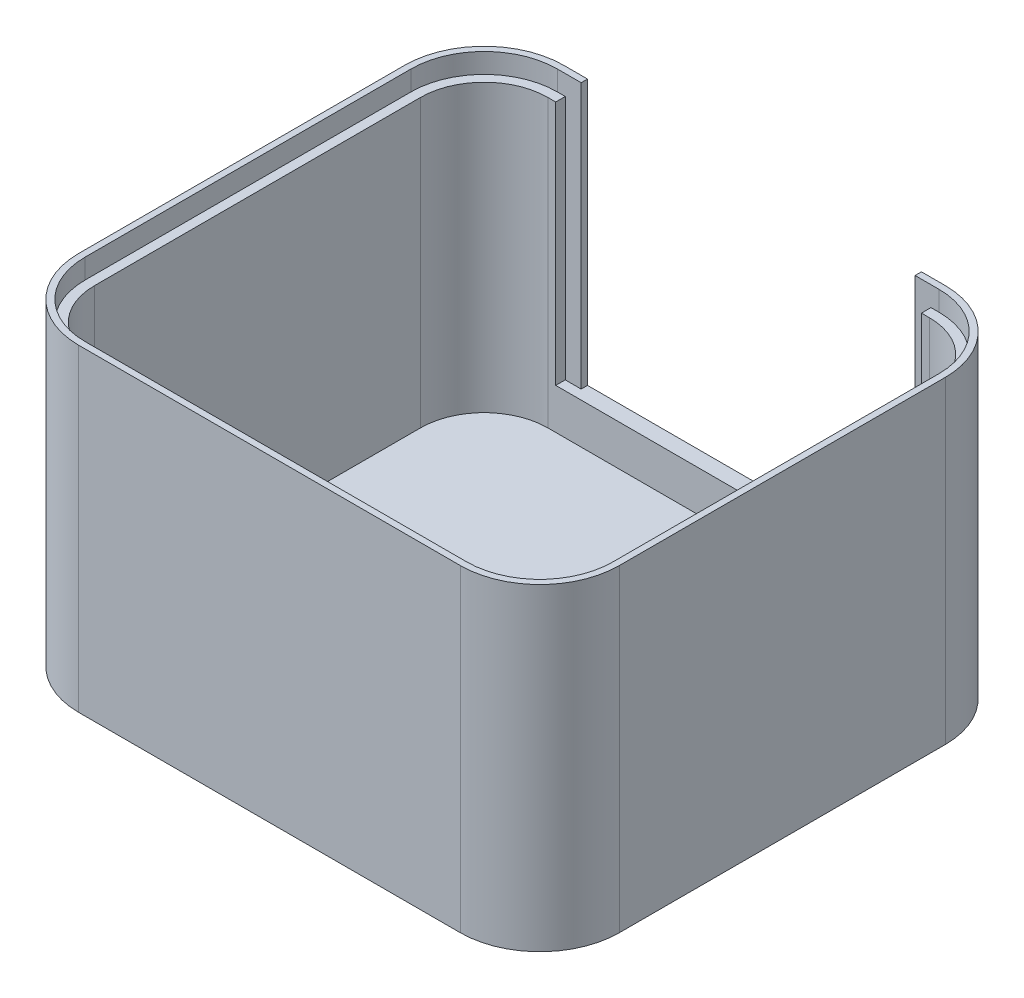
ISO-10303-21;
HEADER;
FILE_DESCRIPTION(('STEP AP214'),'2;1');
FILE_NAME('part.step','',(''),(''),'','','');
FILE_SCHEMA(('AUTOMOTIVE_DESIGN { 1 0 10303 214 1 1 1 1 }'));
ENDSEC;
DATA;
#1=APPLICATION_CONTEXT('core data for automotive mechanical design processes');
#2=APPLICATION_PROTOCOL_DEFINITION('international standard','automotive_design',2000,#1);
#3=PRODUCT_CONTEXT('',#1,'mechanical');
#4=PRODUCT('Part','Part','',(#3));
#5=PRODUCT_RELATED_PRODUCT_CATEGORY('part','',(#4));
#6=PRODUCT_DEFINITION_FORMATION('','',#4);
#7=PRODUCT_DEFINITION_CONTEXT('part definition',#1,'design');
#8=PRODUCT_DEFINITION('design','',#6,#7);
#9=PRODUCT_DEFINITION_SHAPE('','',#8);
#10=(LENGTH_UNIT() NAMED_UNIT(*) SI_UNIT(.MILLI.,.METRE.));
#11=(NAMED_UNIT(*) PLANE_ANGLE_UNIT() SI_UNIT($,.RADIAN.));
#12=(NAMED_UNIT(*) SI_UNIT($,.STERADIAN.) SOLID_ANGLE_UNIT());
#13=UNCERTAINTY_MEASURE_WITH_UNIT(LENGTH_MEASURE(1.E-05),#10,'distance_accuracy_value','');
#14=(GEOMETRIC_REPRESENTATION_CONTEXT(3) GLOBAL_UNCERTAINTY_ASSIGNED_CONTEXT((#13)) GLOBAL_UNIT_ASSIGNED_CONTEXT((#10,
#11,#12)) REPRESENTATION_CONTEXT('',''));
#15=CARTESIAN_POINT('',(0.,0.,0.));
#16=DIRECTION('',(0.,0.,1.));
#17=DIRECTION('',(1.,0.,0.));
#18=AXIS2_PLACEMENT_3D('',#15,#16,#17);
#19=CARTESIAN_POINT('',(48.,75.,-59.4));
#20=DIRECTION('',(0.,0.,-1.));
#21=DIRECTION('',(-1.,0.,0.));
#22=AXIS2_PLACEMENT_3D('',#19,#20,#21);
#23=PLANE('',#22);
#24=DIRECTION('',(-1.,0.,0.));
#25=VECTOR('',#24,1.);
#26=CARTESIAN_POINT('',(48.,75.,-59.4));
#27=LINE('',#26,#25);
#28=CARTESIAN_POINT('',(-46.,75.,-59.4));
#29=VERTEX_POINT('',#28);
#30=CARTESIAN_POINT('',(-48.,75.,-59.4));
#31=VERTEX_POINT('',#30);
#32=EDGE_CURVE('E343',#29,#31,#27,.T.);
#33=ORIENTED_EDGE('',*,*,#32,.F.);
#34=DIRECTION('',(0.,1.,0.));
#35=VECTOR('',#34,1.);
#36=CARTESIAN_POINT('',(-46.,13.25,-59.4));
#37=LINE('',#36,#35);
#38=CARTESIAN_POINT('',(-46.,13.25,-59.4));
#39=VERTEX_POINT('',#38);
#40=EDGE_CURVE('E291',#39,#29,#37,.T.);
#41=ORIENTED_EDGE('',*,*,#40,.F.);
#42=DIRECTION('',(-1.,0.,0.));
#43=VECTOR('',#42,1.);
#44=CARTESIAN_POINT('',(-42.,13.25,-59.4));
#45=LINE('',#44,#43);
#46=CARTESIAN_POINT('',(-42.,13.25,-59.4));
#47=VERTEX_POINT('',#46);
#48=EDGE_CURVE('E280',#47,#39,#45,.T.);
#49=ORIENTED_EDGE('',*,*,#48,.F.);
#50=DIRECTION('',(0.,1.,0.));
#51=VECTOR('',#50,1.);
#52=CARTESIAN_POINT('',(-42.,13.25,-59.4));
#53=LINE('',#52,#51);
#54=CARTESIAN_POINT('',(-42.,80.,-59.4));
#55=VERTEX_POINT('',#54);
#56=EDGE_CURVE('E293',#47,#55,#53,.T.);
#57=ORIENTED_EDGE('',*,*,#56,.T.);
#58=DIRECTION('',(-1.,0.,0.));
#59=VECTOR('',#58,1.);
#60=CARTESIAN_POINT('',(48.,80.,-59.4));
#61=LINE('',#60,#59);
#62=CARTESIAN_POINT('',(-48.,80.,-59.4));
#63=VERTEX_POINT('',#62);
#64=EDGE_CURVE('E367',#55,#63,#61,.T.);
#65=ORIENTED_EDGE('',*,*,#64,.T.);
#66=DIRECTION('',(0.,1.,0.));
#67=VECTOR('',#66,1.);
#68=CARTESIAN_POINT('',(-48.,75.,-59.4));
#69=LINE('',#68,#67);
#70=EDGE_CURVE('E400',#31,#63,#69,.T.);
#71=ORIENTED_EDGE('',*,*,#70,.F.);
#72=EDGE_LOOP('',(#33,#41,#49,#57,#65,#71));
#73=FACE_BOUND('',#72,.T.);
#74=ADVANCED_FACE('F33',(#73),#23,.F.);
#75=CARTESIAN_POINT('',(68.,80.,-61.));
#76=DIRECTION('',(-1.,0.,0.));
#77=DIRECTION('',(0.,0.,1.));
#78=AXIS2_PLACEMENT_3D('',#75,#76,#77);
#79=PLANE('',#78);
#80=DIRECTION('',(0.,0.,-1.));
#81=VECTOR('',#80,1.);
#82=CARTESIAN_POINT('',(68.,80.,-61.));
#83=LINE('',#82,#81);
#84=CARTESIAN_POINT('',(68.,80.,41.));
#85=VERTEX_POINT('',#84);
#86=CARTESIAN_POINT('',(68.,80.,-41.));
#87=VERTEX_POINT('',#86);
#88=EDGE_CURVE('E444',#85,#87,#83,.T.);
#89=ORIENTED_EDGE('',*,*,#88,.F.);
#90=DIRECTION('',(0.,-1.,0.));
#91=VECTOR('',#90,1.);
#92=CARTESIAN_POINT('',(68.,80.,41.));
#93=LINE('',#92,#91);
#94=CARTESIAN_POINT('',(68.,0.,41.));
#95=VERTEX_POINT('',#94);
#96=EDGE_CURVE('E496',#85,#95,#93,.T.);
#97=ORIENTED_EDGE('',*,*,#96,.T.);
#98=DIRECTION('',(0.,0.,-1.));
#99=VECTOR('',#98,1.);
#100=CARTESIAN_POINT('',(68.,0.,-61.));
#101=LINE('',#100,#99);
#102=CARTESIAN_POINT('',(68.,0.,-41.));
#103=VERTEX_POINT('',#102);
#104=EDGE_CURVE('E435',#95,#103,#101,.T.);
#105=ORIENTED_EDGE('',*,*,#104,.T.);
#106=DIRECTION('',(0.,-1.,0.));
#107=VECTOR('',#106,1.);
#108=CARTESIAN_POINT('',(68.,80.,-41.));
#109=LINE('',#108,#107);
#110=EDGE_CURVE('E494',#103,#87,#109,.F.);
#111=ORIENTED_EDGE('',*,*,#110,.T.);
#112=EDGE_LOOP('',(#89,#97,#105,#111));
#113=FACE_BOUND('',#112,.T.);
#114=ADVANCED_FACE('F532',(#113),#79,.F.);
#115=CARTESIAN_POINT('',(-68.,80.,-61.));
#116=DIRECTION('',(0.,0.,1.));
#117=DIRECTION('',(1.,0.,0.));
#118=AXIS2_PLACEMENT_3D('',#115,#116,#117);
#119=PLANE('',#118);
#120=DIRECTION('',(-1.,0.,0.));
#121=VECTOR('',#120,1.);
#122=CARTESIAN_POINT('',(-68.,80.,-61.));
#123=LINE('',#122,#121);
#124=CARTESIAN_POINT('',(-42.,80.,-61.));
#125=VERTEX_POINT('',#124);
#126=CARTESIAN_POINT('',(-48.,80.,-61.));
#127=VERTEX_POINT('',#126);
#128=EDGE_CURVE('E447',#125,#127,#123,.T.);
#129=ORIENTED_EDGE('',*,*,#128,.F.);
#130=DIRECTION('',(0.,1.,0.));
#131=VECTOR('',#130,1.);
#132=CARTESIAN_POINT('',(-42.,13.25,-61.));
#133=LINE('',#132,#131);
#134=CARTESIAN_POINT('',(-42.,13.25,-61.));
#135=VERTEX_POINT('',#134);
#136=EDGE_CURVE('E295',#135,#125,#133,.T.);
#137=ORIENTED_EDGE('',*,*,#136,.F.);
#138=DIRECTION('',(-1.,0.,0.));
#139=VECTOR('',#138,1.);
#140=CARTESIAN_POINT('',(42.,13.25,-61.));
#141=LINE('',#140,#139);
#142=CARTESIAN_POINT('',(42.,13.25,-61.));
#143=VERTEX_POINT('',#142);
#144=EDGE_CURVE('E274',#143,#135,#141,.T.);
#145=ORIENTED_EDGE('',*,*,#144,.F.);
#146=DIRECTION('',(0.,1.,0.));
#147=VECTOR('',#146,1.);
#148=CARTESIAN_POINT('',(42.,13.25,-61.));
#149=LINE('',#148,#147);
#150=CARTESIAN_POINT('',(42.,80.,-61.));
#151=VERTEX_POINT('',#150);
#152=EDGE_CURVE('E297',#143,#151,#149,.T.);
#153=ORIENTED_EDGE('',*,*,#152,.T.);
#154=CARTESIAN_POINT('',(48.,80.,-61.));
#155=VERTEX_POINT('',#154);
#156=EDGE_CURVE('E449',#155,#151,#123,.T.);
#157=ORIENTED_EDGE('',*,*,#156,.F.);
#158=DIRECTION('',(0.,-1.,0.));
#159=VECTOR('',#158,1.);
#160=CARTESIAN_POINT('',(48.,80.,-61.));
#161=LINE('',#160,#159);
#162=CARTESIAN_POINT('',(48.,0.,-61.));
#163=VERTEX_POINT('',#162);
#164=EDGE_CURVE('E11',#155,#163,#161,.T.);
#165=ORIENTED_EDGE('',*,*,#164,.T.);
#166=DIRECTION('',(-1.,0.,0.));
#167=VECTOR('',#166,1.);
#168=CARTESIAN_POINT('',(-68.,0.,-61.));
#169=LINE('',#168,#167);
#170=CARTESIAN_POINT('',(-48.,0.,-61.));
#171=VERTEX_POINT('',#170);
#172=EDGE_CURVE('E461',#163,#171,#169,.T.);
#173=ORIENTED_EDGE('',*,*,#172,.T.);
#174=DIRECTION('',(0.,-1.,0.));
#175=VECTOR('',#174,1.);
#176=CARTESIAN_POINT('',(-48.,80.,-61.));
#177=LINE('',#176,#175);
#178=EDGE_CURVE('E41',#171,#127,#177,.F.);
#179=ORIENTED_EDGE('',*,*,#178,.T.);
#180=EDGE_LOOP('',(#129,#137,#145,#153,#157,#165,#173,#179));
#181=FACE_BOUND('',#180,.T.);
#182=ADVANCED_FACE('F503',(#181),#119,.F.);
#183=CARTESIAN_POINT('',(-68.,80.,-61.));
#184=DIRECTION('',(1.,0.,0.));
#185=DIRECTION('',(0.,0.,-1.));
#186=AXIS2_PLACEMENT_3D('',#183,#184,#185);
#187=PLANE('',#186);
#188=DIRECTION('',(0.,0.,1.));
#189=VECTOR('',#188,1.);
#190=CARTESIAN_POINT('',(-68.,0.,-61.));
#191=LINE('',#190,#189);
#192=CARTESIAN_POINT('',(-68.,0.,-41.));
#193=VERTEX_POINT('',#192);
#194=CARTESIAN_POINT('',(-68.,0.,41.));
#195=VERTEX_POINT('',#194);
#196=EDGE_CURVE('E464',#193,#195,#191,.T.);
#197=ORIENTED_EDGE('',*,*,#196,.T.);
#198=DIRECTION('',(0.,-1.,0.));
#199=VECTOR('',#198,1.);
#200=CARTESIAN_POINT('',(-68.,80.,41.));
#201=LINE('',#200,#199);
#202=CARTESIAN_POINT('',(-68.,80.,41.));
#203=VERTEX_POINT('',#202);
#204=EDGE_CURVE('E484',#195,#203,#201,.F.);
#205=ORIENTED_EDGE('',*,*,#204,.T.);
#206=DIRECTION('',(0.,0.,1.));
#207=VECTOR('',#206,1.);
#208=CARTESIAN_POINT('',(-68.,80.,-61.));
#209=LINE('',#208,#207);
#210=CARTESIAN_POINT('',(-68.,80.,-41.));
#211=VERTEX_POINT('',#210);
#212=EDGE_CURVE('E452',#211,#203,#209,.T.);
#213=ORIENTED_EDGE('',*,*,#212,.F.);
#214=DIRECTION('',(0.,-1.,0.));
#215=VECTOR('',#214,1.);
#216=CARTESIAN_POINT('',(-68.,80.,-41.));
#217=LINE('',#216,#215);
#218=EDGE_CURVE('E481',#211,#193,#217,.T.);
#219=ORIENTED_EDGE('',*,*,#218,.T.);
#220=EDGE_LOOP('',(#197,#205,#213,#219));
#221=FACE_BOUND('',#220,.T.);
#222=ADVANCED_FACE('F514',(#221),#187,.F.);
#223=CARTESIAN_POINT('',(-68.,80.,61.));
#224=DIRECTION('',(0.,0.,-1.));
#225=DIRECTION('',(-1.,0.,0.));
#226=AXIS2_PLACEMENT_3D('',#223,#224,#225);
#227=PLANE('',#226);
#228=DIRECTION('',(1.,0.,0.));
#229=VECTOR('',#228,1.);
#230=CARTESIAN_POINT('',(-68.,80.,61.));
#231=LINE('',#230,#229);
#232=CARTESIAN_POINT('',(-48.,80.,61.));
#233=VERTEX_POINT('',#232);
#234=CARTESIAN_POINT('',(48.,80.,61.));
#235=VERTEX_POINT('',#234);
#236=EDGE_CURVE('E455',#233,#235,#231,.T.);
#237=ORIENTED_EDGE('',*,*,#236,.F.);
#238=DIRECTION('',(0.,-1.,0.));
#239=VECTOR('',#238,1.);
#240=CARTESIAN_POINT('',(-48.,80.,61.));
#241=LINE('',#240,#239);
#242=CARTESIAN_POINT('',(-48.,0.,61.));
#243=VERTEX_POINT('',#242);
#244=EDGE_CURVE('E470',#233,#243,#241,.T.);
#245=ORIENTED_EDGE('',*,*,#244,.T.);
#246=DIRECTION('',(1.,0.,0.));
#247=VECTOR('',#246,1.);
#248=CARTESIAN_POINT('',(-68.,0.,61.));
#249=LINE('',#248,#247);
#250=CARTESIAN_POINT('',(48.,0.,61.));
#251=VERTEX_POINT('',#250);
#252=EDGE_CURVE('E448',#243,#251,#249,.T.);
#253=ORIENTED_EDGE('',*,*,#252,.T.);
#254=DIRECTION('',(0.,-1.,0.));
#255=VECTOR('',#254,1.);
#256=CARTESIAN_POINT('',(48.,80.,61.));
#257=LINE('',#256,#255);
#258=EDGE_CURVE('E458',#251,#235,#257,.F.);
#259=ORIENTED_EDGE('',*,*,#258,.T.);
#260=EDGE_LOOP('',(#237,#245,#253,#259));
#261=FACE_BOUND('',#260,.T.);
#262=ADVANCED_FACE('F523',(#261),#227,.F.);
#263=CARTESIAN_POINT('',(0.,80.,0.));
#264=DIRECTION('',(0.,1.,0.));
#265=DIRECTION('',(0.,0.,1.));
#266=AXIS2_PLACEMENT_3D('',#263,#264,#265);
#267=PLANE('',#266);
#268=DIRECTION('',(0.,0.,1.));
#269=VECTOR('',#268,1.);
#270=CARTESIAN_POINT('',(-42.,80.,-61.));
#271=LINE('',#270,#269);
#272=EDGE_CURVE('E267',#125,#55,#271,.T.);
#273=ORIENTED_EDGE('',*,*,#272,.F.);
#274=ORIENTED_EDGE('',*,*,#128,.T.);
#275=CARTESIAN_POINT('',(-48.,80.,-41.));
#276=DIRECTION('',(0.,1.,0.));
#277=DIRECTION('',(0.,0.,1.));
#278=AXIS2_PLACEMENT_3D('',#275,#276,#277);
#279=CIRCLE('',#278,20.);
#280=EDGE_CURVE('E486',#127,#211,#279,.T.);
#281=ORIENTED_EDGE('',*,*,#280,.T.);
#282=ORIENTED_EDGE('',*,*,#212,.T.);
#283=CARTESIAN_POINT('',(-48.,80.,41.));
#284=DIRECTION('',(0.,1.,0.));
#285=DIRECTION('',(0.,0.,1.));
#286=AXIS2_PLACEMENT_3D('',#283,#284,#285);
#287=CIRCLE('',#286,20.);
#288=EDGE_CURVE('E492',#203,#233,#287,.T.);
#289=ORIENTED_EDGE('',*,*,#288,.T.);
#290=ORIENTED_EDGE('',*,*,#236,.T.);
#291=CARTESIAN_POINT('',(48.,80.,41.));
#292=DIRECTION('',(0.,1.,0.));
#293=DIRECTION('',(0.,0.,1.));
#294=AXIS2_PLACEMENT_3D('',#291,#292,#293);
#295=CIRCLE('',#294,20.);
#296=EDGE_CURVE('E490',#235,#85,#295,.T.);
#297=ORIENTED_EDGE('',*,*,#296,.T.);
#298=ORIENTED_EDGE('',*,*,#88,.T.);
#299=CARTESIAN_POINT('',(48.,80.,-41.));
#300=DIRECTION('',(0.,1.,0.));
#301=DIRECTION('',(0.,0.,1.));
#302=AXIS2_PLACEMENT_3D('',#299,#300,#301);
#303=CIRCLE('',#302,20.);
#304=EDGE_CURVE('E488',#87,#155,#303,.T.);
#305=ORIENTED_EDGE('',*,*,#304,.T.);
#306=ORIENTED_EDGE('',*,*,#156,.T.);
#307=DIRECTION('',(0.,0.,-1.));
#308=VECTOR('',#307,1.);
#309=CARTESIAN_POINT('',(42.,80.,-61.));
#310=LINE('',#309,#308);
#311=CARTESIAN_POINT('',(42.,80.,-59.4));
#312=VERTEX_POINT('',#311);
#313=EDGE_CURVE('E270',#312,#151,#310,.T.);
#314=ORIENTED_EDGE('',*,*,#313,.F.);
#315=CARTESIAN_POINT('',(48.,80.,-59.4));
#316=VERTEX_POINT('',#315);
#317=EDGE_CURVE('E368',#316,#312,#61,.T.);
#318=ORIENTED_EDGE('',*,*,#317,.F.);
#319=CARTESIAN_POINT('',(48.,80.,-41.));
#320=DIRECTION('',(0.,1.,0.));
#321=DIRECTION('',(0.,0.,1.));
#322=AXIS2_PLACEMENT_3D('',#319,#320,#321);
#323=CIRCLE('',#322,18.4);
#324=CARTESIAN_POINT('',(66.4,80.,-41.));
#325=VERTEX_POINT('',#324);
#326=EDGE_CURVE('E56',#325,#316,#323,.T.);
#327=ORIENTED_EDGE('',*,*,#326,.F.);
#328=DIRECTION('',(0.,0.,-1.));
#329=VECTOR('',#328,1.);
#330=CARTESIAN_POINT('',(66.4,80.,41.));
#331=LINE('',#330,#329);
#332=CARTESIAN_POINT('',(66.4,80.,41.));
#333=VERTEX_POINT('',#332);
#334=EDGE_CURVE('E344',#333,#325,#331,.T.);
#335=ORIENTED_EDGE('',*,*,#334,.F.);
#336=CARTESIAN_POINT('',(48.,80.,41.));
#337=DIRECTION('',(0.,1.,0.));
#338=DIRECTION('',(0.,0.,1.));
#339=AXIS2_PLACEMENT_3D('',#336,#337,#338);
#340=CIRCLE('',#339,18.4);
#341=CARTESIAN_POINT('',(48.,80.,59.4));
#342=VERTEX_POINT('',#341);
#343=EDGE_CURVE('E382',#342,#333,#340,.T.);
#344=ORIENTED_EDGE('',*,*,#343,.F.);
#345=DIRECTION('',(1.,0.,0.));
#346=VECTOR('',#345,1.);
#347=CARTESIAN_POINT('',(-48.,80.,59.4));
#348=LINE('',#347,#346);
#349=CARTESIAN_POINT('',(-48.,80.,59.4));
#350=VERTEX_POINT('',#349);
#351=EDGE_CURVE('E379',#350,#342,#348,.T.);
#352=ORIENTED_EDGE('',*,*,#351,.F.);
#353=CARTESIAN_POINT('',(-48.,80.,41.));
#354=DIRECTION('',(0.,1.,0.));
#355=DIRECTION('',(0.,0.,1.));
#356=AXIS2_PLACEMENT_3D('',#353,#354,#355);
#357=CIRCLE('',#356,18.4);
#358=CARTESIAN_POINT('',(-66.4,80.,41.));
#359=VERTEX_POINT('',#358);
#360=EDGE_CURVE('E376',#359,#350,#357,.T.);
#361=ORIENTED_EDGE('',*,*,#360,.F.);
#362=DIRECTION('',(0.,0.,1.));
#363=VECTOR('',#362,1.);
#364=CARTESIAN_POINT('',(-66.4,80.,-41.));
#365=LINE('',#364,#363);
#366=CARTESIAN_POINT('',(-66.4,80.,-41.));
#367=VERTEX_POINT('',#366);
#368=EDGE_CURVE('E373',#367,#359,#365,.T.);
#369=ORIENTED_EDGE('',*,*,#368,.F.);
#370=CARTESIAN_POINT('',(-48.,80.,-41.));
#371=DIRECTION('',(0.,1.,0.));
#372=DIRECTION('',(0.,0.,1.));
#373=AXIS2_PLACEMENT_3D('',#370,#371,#372);
#374=CIRCLE('',#373,18.4);
#375=EDGE_CURVE('E370',#63,#367,#374,.T.);
#376=ORIENTED_EDGE('',*,*,#375,.F.);
#377=ORIENTED_EDGE('',*,*,#64,.F.);
#378=EDGE_LOOP('',(#273,#274,#281,#282,#289,#290,#297,#298,#305,#306,#314,#318,#327,#335,#344,
#352,#361,#369,#376,#377));
#379=FACE_BOUND('',#378,.T.);
#380=ADVANCED_FACE('F511',(#379),#267,.T.);
#381=CARTESIAN_POINT('',(0.,0.,0.));
#382=DIRECTION('',(0.,1.,0.));
#383=DIRECTION('',(0.,0.,1.));
#384=AXIS2_PLACEMENT_3D('',#381,#382,#383);
#385=PLANE('',#384);
#386=CARTESIAN_POINT('',(-25.4,0.,0.));
#387=DIRECTION('',(0.,1.,0.));
#388=DIRECTION('',(0.,0.,1.));
#389=AXIS2_PLACEMENT_3D('',#386,#387,#388);
#390=CIRCLE('',#389,1.63195);
#391=CARTESIAN_POINT('',(-25.4,0.,1.63195));
#392=VERTEX_POINT('',#391);
#393=EDGE_CURVE('E306',#392,#392,#390,.T.);
#394=ORIENTED_EDGE('',*,*,#393,.T.);
#395=EDGE_LOOP('',(#394));
#396=FACE_BOUND('',#395,.T.);
#397=CARTESIAN_POINT('',(25.4,0.,0.));
#398=DIRECTION('',(0.,1.,0.));
#399=DIRECTION('',(0.,0.,1.));
#400=AXIS2_PLACEMENT_3D('',#397,#398,#399);
#401=CIRCLE('',#400,1.63195);
#402=CARTESIAN_POINT('',(25.4,0.,1.63194999999999));
#403=VERTEX_POINT('',#402);
#404=EDGE_CURVE('E312',#403,#403,#401,.T.);
#405=ORIENTED_EDGE('',*,*,#404,.T.);
#406=EDGE_LOOP('',(#405));
#407=FACE_BOUND('',#406,.T.);
#408=ORIENTED_EDGE('',*,*,#252,.F.);
#409=CARTESIAN_POINT('',(-48.,0.,41.));
#410=DIRECTION('',(0.,1.,0.));
#411=DIRECTION('',(0.,0.,1.));
#412=AXIS2_PLACEMENT_3D('',#409,#410,#411);
#413=CIRCLE('',#412,20.);
#414=EDGE_CURVE('E479',#243,#195,#413,.F.);
#415=ORIENTED_EDGE('',*,*,#414,.T.);
#416=ORIENTED_EDGE('',*,*,#196,.F.);
#417=CARTESIAN_POINT('',(-48.,0.,-41.));
#418=DIRECTION('',(0.,1.,0.));
#419=DIRECTION('',(0.,0.,1.));
#420=AXIS2_PLACEMENT_3D('',#417,#418,#419);
#421=CIRCLE('',#420,20.);
#422=EDGE_CURVE('E473',#193,#171,#421,.F.);
#423=ORIENTED_EDGE('',*,*,#422,.T.);
#424=ORIENTED_EDGE('',*,*,#172,.F.);
#425=CARTESIAN_POINT('',(48.,0.,-41.));
#426=DIRECTION('',(0.,1.,0.));
#427=DIRECTION('',(0.,0.,1.));
#428=AXIS2_PLACEMENT_3D('',#425,#426,#427);
#429=CIRCLE('',#428,20.);
#430=EDGE_CURVE('E475',#163,#103,#429,.F.);
#431=ORIENTED_EDGE('',*,*,#430,.T.);
#432=ORIENTED_EDGE('',*,*,#104,.F.);
#433=CARTESIAN_POINT('',(48.,0.,41.));
#434=DIRECTION('',(0.,1.,0.));
#435=DIRECTION('',(0.,0.,1.));
#436=AXIS2_PLACEMENT_3D('',#433,#434,#435);
#437=CIRCLE('',#436,20.);
#438=EDGE_CURVE('E477',#95,#251,#437,.F.);
#439=ORIENTED_EDGE('',*,*,#438,.T.);
#440=EDGE_LOOP('',(#408,#415,#416,#423,#424,#431,#432,#439));
#441=FACE_BOUND('',#440,.T.);
#442=ADVANCED_FACE('F720',(#396,#407,#441),#385,.F.);
#443=CARTESIAN_POINT('',(-48.,80.,41.));
#444=DIRECTION('',(0.,-1.,0.));
#445=DIRECTION('',(0.,0.,-1.));
#446=AXIS2_PLACEMENT_3D('',#443,#444,#445);
#447=CYLINDRICAL_SURFACE('',#446,20.);
#448=ORIENTED_EDGE('',*,*,#288,.F.);
#449=ORIENTED_EDGE('',*,*,#204,.F.);
#450=ORIENTED_EDGE('',*,*,#414,.F.);
#451=ORIENTED_EDGE('',*,*,#244,.F.);
#452=EDGE_LOOP('',(#448,#449,#450,#451));
#453=FACE_BOUND('',#452,.T.);
#454=ADVANCED_FACE('F518',(#453),#447,.T.);
#455=CARTESIAN_POINT('',(48.,80.,41.));
#456=DIRECTION('',(0.,-1.,0.));
#457=DIRECTION('',(0.,0.,-1.));
#458=AXIS2_PLACEMENT_3D('',#455,#456,#457);
#459=CYLINDRICAL_SURFACE('',#458,20.);
#460=ORIENTED_EDGE('',*,*,#296,.F.);
#461=ORIENTED_EDGE('',*,*,#258,.F.);
#462=ORIENTED_EDGE('',*,*,#438,.F.);
#463=ORIENTED_EDGE('',*,*,#96,.F.);
#464=EDGE_LOOP('',(#460,#461,#462,#463));
#465=FACE_BOUND('',#464,.T.);
#466=ADVANCED_FACE('F527',(#465),#459,.T.);
#467=CARTESIAN_POINT('',(48.,80.,-41.));
#468=DIRECTION('',(0.,-1.,0.));
#469=DIRECTION('',(0.,0.,-1.));
#470=AXIS2_PLACEMENT_3D('',#467,#468,#469);
#471=CYLINDRICAL_SURFACE('',#470,20.);
#472=ORIENTED_EDGE('',*,*,#304,.F.);
#473=ORIENTED_EDGE('',*,*,#110,.F.);
#474=ORIENTED_EDGE('',*,*,#430,.F.);
#475=ORIENTED_EDGE('',*,*,#164,.F.);
#476=EDGE_LOOP('',(#472,#473,#474,#475));
#477=FACE_BOUND('',#476,.T.);
#478=ADVANCED_FACE('F536',(#477),#471,.T.);
#479=CARTESIAN_POINT('',(-48.,80.,-41.));
#480=DIRECTION('',(0.,-1.,0.));
#481=DIRECTION('',(0.,0.,-1.));
#482=AXIS2_PLACEMENT_3D('',#479,#480,#481);
#483=CYLINDRICAL_SURFACE('',#482,20.);
#484=ORIENTED_EDGE('',*,*,#280,.F.);
#485=ORIENTED_EDGE('',*,*,#178,.F.);
#486=ORIENTED_EDGE('',*,*,#422,.F.);
#487=ORIENTED_EDGE('',*,*,#218,.F.);
#488=EDGE_LOOP('',(#484,#485,#486,#487));
#489=FACE_BOUND('',#488,.T.);
#490=ADVANCED_FACE('F35',(#489),#483,.T.);
#491=CARTESIAN_POINT('',(48.,75.,-41.));
#492=DIRECTION('',(0.,1.,0.));
#493=DIRECTION('',(0.,0.,1.));
#494=AXIS2_PLACEMENT_3D('',#491,#492,#493);
#495=CYLINDRICAL_SURFACE('',#494,18.4);
#496=ORIENTED_EDGE('',*,*,#326,.T.);
#497=DIRECTION('',(0.,1.,0.));
#498=VECTOR('',#497,1.);
#499=CARTESIAN_POINT('',(48.,75.,-59.4));
#500=LINE('',#499,#498);
#501=CARTESIAN_POINT('',(48.,75.,-59.4));
#502=VERTEX_POINT('',#501);
#503=EDGE_CURVE('E365',#502,#316,#500,.T.);
#504=ORIENTED_EDGE('',*,*,#503,.F.);
#505=CARTESIAN_POINT('',(48.,75.,-41.));
#506=DIRECTION('',(0.,1.,0.));
#507=DIRECTION('',(0.,0.,1.));
#508=AXIS2_PLACEMENT_3D('',#505,#506,#507);
#509=CIRCLE('',#508,18.4);
#510=CARTESIAN_POINT('',(66.4,75.,-41.));
#511=VERTEX_POINT('',#510);
#512=EDGE_CURVE('E340',#511,#502,#509,.T.);
#513=ORIENTED_EDGE('',*,*,#512,.F.);
#514=DIRECTION('',(0.,1.,0.));
#515=VECTOR('',#514,1.);
#516=CARTESIAN_POINT('',(66.4,75.,-41.));
#517=LINE('',#516,#515);
#518=EDGE_CURVE('E387',#511,#325,#517,.T.);
#519=ORIENTED_EDGE('',*,*,#518,.T.);
#520=EDGE_LOOP('',(#496,#504,#513,#519));
#521=FACE_BOUND('',#520,.T.);
#522=ADVANCED_FACE('F618',(#521),#495,.F.);
#523=CARTESIAN_POINT('',(66.4,75.,41.));
#524=DIRECTION('',(1.,0.,0.));
#525=DIRECTION('',(0.,0.,-1.));
#526=AXIS2_PLACEMENT_3D('',#523,#524,#525);
#527=PLANE('',#526);
#528=ORIENTED_EDGE('',*,*,#334,.T.);
#529=ORIENTED_EDGE('',*,*,#518,.F.);
#530=DIRECTION('',(0.,0.,-1.));
#531=VECTOR('',#530,1.);
#532=CARTESIAN_POINT('',(66.4,75.,41.));
#533=LINE('',#532,#531);
#534=CARTESIAN_POINT('',(66.4,75.,41.));
#535=VERTEX_POINT('',#534);
#536=EDGE_CURVE('E362',#535,#511,#533,.T.);
#537=ORIENTED_EDGE('',*,*,#536,.F.);
#538=DIRECTION('',(0.,1.,0.));
#539=VECTOR('',#538,1.);
#540=CARTESIAN_POINT('',(66.4,75.,41.));
#541=LINE('',#540,#539);
#542=EDGE_CURVE('E390',#535,#333,#541,.T.);
#543=ORIENTED_EDGE('',*,*,#542,.T.);
#544=EDGE_LOOP('',(#528,#529,#537,#543));
#545=FACE_BOUND('',#544,.T.);
#546=ADVANCED_FACE('F571',(#545),#527,.F.);
#547=CARTESIAN_POINT('',(48.,75.,41.));
#548=DIRECTION('',(0.,1.,0.));
#549=DIRECTION('',(0.,0.,1.));
#550=AXIS2_PLACEMENT_3D('',#547,#548,#549);
#551=CYLINDRICAL_SURFACE('',#550,18.4);
#552=ORIENTED_EDGE('',*,*,#343,.T.);
#553=ORIENTED_EDGE('',*,*,#542,.F.);
#554=CARTESIAN_POINT('',(48.,75.,41.));
#555=DIRECTION('',(0.,1.,0.));
#556=DIRECTION('',(0.,0.,1.));
#557=AXIS2_PLACEMENT_3D('',#554,#555,#556);
#558=CIRCLE('',#557,18.4);
#559=CARTESIAN_POINT('',(48.,75.,59.4));
#560=VERTEX_POINT('',#559);
#561=EDGE_CURVE('E359',#560,#535,#558,.T.);
#562=ORIENTED_EDGE('',*,*,#561,.F.);
#563=DIRECTION('',(0.,1.,0.));
#564=VECTOR('',#563,1.);
#565=CARTESIAN_POINT('',(48.,75.,59.4));
#566=LINE('',#565,#564);
#567=EDGE_CURVE('E392',#560,#342,#566,.T.);
#568=ORIENTED_EDGE('',*,*,#567,.T.);
#569=EDGE_LOOP('',(#552,#553,#562,#568));
#570=FACE_BOUND('',#569,.T.);
#571=ADVANCED_FACE('F575',(#570),#551,.F.);
#572=CARTESIAN_POINT('',(-48.,75.,59.4));
#573=DIRECTION('',(0.,0.,1.));
#574=DIRECTION('',(1.,0.,0.));
#575=AXIS2_PLACEMENT_3D('',#572,#573,#574);
#576=PLANE('',#575);
#577=ORIENTED_EDGE('',*,*,#351,.T.);
#578=ORIENTED_EDGE('',*,*,#567,.F.);
#579=DIRECTION('',(1.,0.,0.));
#580=VECTOR('',#579,1.);
#581=CARTESIAN_POINT('',(-48.,75.,59.4));
#582=LINE('',#581,#580);
#583=CARTESIAN_POINT('',(-48.,75.,59.4));
#584=VERTEX_POINT('',#583);
#585=EDGE_CURVE('E356',#584,#560,#582,.T.);
#586=ORIENTED_EDGE('',*,*,#585,.F.);
#587=DIRECTION('',(0.,1.,0.));
#588=VECTOR('',#587,1.);
#589=CARTESIAN_POINT('',(-48.,75.,59.4));
#590=LINE('',#589,#588);
#591=EDGE_CURVE('E394',#584,#350,#590,.T.);
#592=ORIENTED_EDGE('',*,*,#591,.T.);
#593=EDGE_LOOP('',(#577,#578,#586,#592));
#594=FACE_BOUND('',#593,.T.);
#595=ADVANCED_FACE('F578',(#594),#576,.F.);
#596=CARTESIAN_POINT('',(-48.,75.,41.));
#597=DIRECTION('',(0.,1.,0.));
#598=DIRECTION('',(0.,0.,1.));
#599=AXIS2_PLACEMENT_3D('',#596,#597,#598);
#600=CYLINDRICAL_SURFACE('',#599,18.4);
#601=ORIENTED_EDGE('',*,*,#360,.T.);
#602=ORIENTED_EDGE('',*,*,#591,.F.);
#603=CARTESIAN_POINT('',(-48.,75.,41.));
#604=DIRECTION('',(0.,1.,0.));
#605=DIRECTION('',(0.,0.,1.));
#606=AXIS2_PLACEMENT_3D('',#603,#604,#605);
#607=CIRCLE('',#606,18.4);
#608=CARTESIAN_POINT('',(-66.4,75.,41.));
#609=VERTEX_POINT('',#608);
#610=EDGE_CURVE('E353',#609,#584,#607,.T.);
#611=ORIENTED_EDGE('',*,*,#610,.F.);
#612=DIRECTION('',(0.,1.,0.));
#613=VECTOR('',#612,1.);
#614=CARTESIAN_POINT('',(-66.4,75.,41.));
#615=LINE('',#614,#613);
#616=EDGE_CURVE('E396',#609,#359,#615,.T.);
#617=ORIENTED_EDGE('',*,*,#616,.T.);
#618=EDGE_LOOP('',(#601,#602,#611,#617));
#619=FACE_BOUND('',#618,.T.);
#620=ADVANCED_FACE('F581',(#619),#600,.F.);
#621=CARTESIAN_POINT('',(-66.4,75.,-41.));
#622=DIRECTION('',(-1.,0.,0.));
#623=DIRECTION('',(0.,0.,1.));
#624=AXIS2_PLACEMENT_3D('',#621,#622,#623);
#625=PLANE('',#624);
#626=ORIENTED_EDGE('',*,*,#368,.T.);
#627=ORIENTED_EDGE('',*,*,#616,.F.);
#628=DIRECTION('',(0.,0.,1.));
#629=VECTOR('',#628,1.);
#630=CARTESIAN_POINT('',(-66.4,75.,-41.));
#631=LINE('',#630,#629);
#632=CARTESIAN_POINT('',(-66.4,75.,-41.));
#633=VERTEX_POINT('',#632);
#634=EDGE_CURVE('E350',#633,#609,#631,.T.);
#635=ORIENTED_EDGE('',*,*,#634,.F.);
#636=DIRECTION('',(0.,1.,0.));
#637=VECTOR('',#636,1.);
#638=CARTESIAN_POINT('',(-66.4,75.,-41.));
#639=LINE('',#638,#637);
#640=EDGE_CURVE('E398',#633,#367,#639,.T.);
#641=ORIENTED_EDGE('',*,*,#640,.T.);
#642=EDGE_LOOP('',(#626,#627,#635,#641));
#643=FACE_BOUND('',#642,.T.);
#644=ADVANCED_FACE('F584',(#643),#625,.F.);
#645=CARTESIAN_POINT('',(-48.,75.,-41.));
#646=DIRECTION('',(0.,1.,0.));
#647=DIRECTION('',(0.,0.,1.));
#648=AXIS2_PLACEMENT_3D('',#645,#646,#647);
#649=CYLINDRICAL_SURFACE('',#648,18.4);
#650=ORIENTED_EDGE('',*,*,#375,.T.);
#651=ORIENTED_EDGE('',*,*,#640,.F.);
#652=CARTESIAN_POINT('',(-48.,75.,-41.));
#653=DIRECTION('',(0.,1.,0.));
#654=DIRECTION('',(0.,0.,1.));
#655=AXIS2_PLACEMENT_3D('',#652,#653,#654);
#656=CIRCLE('',#655,18.4);
#657=EDGE_CURVE('E347',#31,#633,#656,.T.);
#658=ORIENTED_EDGE('',*,*,#657,.F.);
#659=ORIENTED_EDGE('',*,*,#70,.T.);
#660=EDGE_LOOP('',(#650,#651,#658,#659));
#661=FACE_BOUND('',#660,.T.);
#662=ADVANCED_FACE('F554',(#661),#649,.F.);
#663=ORIENTED_EDGE('',*,*,#317,.T.);
#664=DIRECTION('',(0.,1.,0.));
#665=VECTOR('',#664,1.);
#666=CARTESIAN_POINT('',(42.,13.25,-59.4));
#667=LINE('',#666,#665);
#668=CARTESIAN_POINT('',(42.,13.25,-59.4));
#669=VERTEX_POINT('',#668);
#670=EDGE_CURVE('E253',#669,#312,#667,.T.);
#671=ORIENTED_EDGE('',*,*,#670,.F.);
#672=DIRECTION('',(-1.,0.,0.));
#673=VECTOR('',#672,1.);
#674=CARTESIAN_POINT('',(42.,13.25,-59.4));
#675=LINE('',#674,#673);
#676=CARTESIAN_POINT('',(46.,13.25,-59.4));
#677=VERTEX_POINT('',#676);
#678=EDGE_CURVE('E257',#677,#669,#675,.T.);
#679=ORIENTED_EDGE('',*,*,#678,.F.);
#680=DIRECTION('',(0.,1.,0.));
#681=VECTOR('',#680,1.);
#682=CARTESIAN_POINT('',(46.,13.25,-59.4));
#683=LINE('',#682,#681);
#684=CARTESIAN_POINT('',(46.,75.,-59.4));
#685=VERTEX_POINT('',#684);
#686=EDGE_CURVE('E243',#677,#685,#683,.T.);
#687=ORIENTED_EDGE('',*,*,#686,.T.);
#688=EDGE_CURVE('E345',#502,#685,#27,.T.);
#689=ORIENTED_EDGE('',*,*,#688,.F.);
#690=ORIENTED_EDGE('',*,*,#503,.T.);
#691=EDGE_LOOP('',(#663,#671,#679,#687,#689,#690));
#692=FACE_BOUND('',#691,.T.);
#693=ADVANCED_FACE('F258',(#692),#23,.F.);
#694=CARTESIAN_POINT('',(48.,75.,-41.));
#695=DIRECTION('',(0.,1.,0.));
#696=DIRECTION('',(0.,0.,1.));
#697=AXIS2_PLACEMENT_3D('',#694,#695,#696);
#698=PLANE('',#697);
#699=DIRECTION('',(0.,0.,-1.));
#700=VECTOR('',#699,1.);
#701=CARTESIAN_POINT('',(46.,75.,-41.));
#702=LINE('',#701,#700);
#703=CARTESIAN_POINT('',(46.,75.,-57.));
#704=VERTEX_POINT('',#703);
#705=EDGE_CURVE('E249',#704,#685,#702,.T.);
#706=ORIENTED_EDGE('',*,*,#705,.F.);
#707=DIRECTION('',(-1.,0.,0.));
#708=VECTOR('',#707,1.);
#709=CARTESIAN_POINT('',(48.,75.,-57.));
#710=LINE('',#709,#708);
#711=CARTESIAN_POINT('',(48.,75.,-57.));
#712=VERTEX_POINT('',#711);
#713=EDGE_CURVE('E319',#712,#704,#710,.T.);
#714=ORIENTED_EDGE('',*,*,#713,.F.);
#715=CARTESIAN_POINT('',(48.,75.,-41.));
#716=DIRECTION('',(0.,1.,0.));
#717=DIRECTION('',(0.,0.,1.));
#718=AXIS2_PLACEMENT_3D('',#715,#716,#717);
#719=CIRCLE('',#718,16.);
#720=CARTESIAN_POINT('',(64.,75.,-41.));
#721=VERTEX_POINT('',#720);
#722=EDGE_CURVE('E315',#721,#712,#719,.T.);
#723=ORIENTED_EDGE('',*,*,#722,.F.);
#724=DIRECTION('',(0.,0.,-1.));
#725=VECTOR('',#724,1.);
#726=CARTESIAN_POINT('',(64.,75.,41.));
#727=LINE('',#726,#725);
#728=CARTESIAN_POINT('',(64.,75.,41.));
#729=VERTEX_POINT('',#728);
#730=EDGE_CURVE('E337',#729,#721,#727,.T.);
#731=ORIENTED_EDGE('',*,*,#730,.F.);
#732=CARTESIAN_POINT('',(48.,75.,41.));
#733=DIRECTION('',(0.,1.,0.));
#734=DIRECTION('',(0.,0.,1.));
#735=AXIS2_PLACEMENT_3D('',#732,#733,#734);
#736=CIRCLE('',#735,16.);
#737=CARTESIAN_POINT('',(48.,75.,57.));
#738=VERTEX_POINT('',#737);
#739=EDGE_CURVE('E334',#738,#729,#736,.T.);
#740=ORIENTED_EDGE('',*,*,#739,.F.);
#741=DIRECTION('',(1.,0.,0.));
#742=VECTOR('',#741,1.);
#743=CARTESIAN_POINT('',(-48.,75.,57.));
#744=LINE('',#743,#742);
#745=CARTESIAN_POINT('',(-48.,75.,57.));
#746=VERTEX_POINT('',#745);
#747=EDGE_CURVE('E331',#746,#738,#744,.T.);
#748=ORIENTED_EDGE('',*,*,#747,.F.);
#749=CARTESIAN_POINT('',(-48.,75.,41.));
#750=DIRECTION('',(0.,1.,0.));
#751=DIRECTION('',(0.,0.,1.));
#752=AXIS2_PLACEMENT_3D('',#749,#750,#751);
#753=CIRCLE('',#752,16.);
#754=CARTESIAN_POINT('',(-64.,75.,41.));
#755=VERTEX_POINT('',#754);
#756=EDGE_CURVE('E328',#755,#746,#753,.T.);
#757=ORIENTED_EDGE('',*,*,#756,.F.);
#758=DIRECTION('',(0.,0.,1.));
#759=VECTOR('',#758,1.);
#760=CARTESIAN_POINT('',(-64.,75.,-41.));
#761=LINE('',#760,#759);
#762=CARTESIAN_POINT('',(-64.,75.,-41.));
#763=VERTEX_POINT('',#762);
#764=EDGE_CURVE('E325',#763,#755,#761,.T.);
#765=ORIENTED_EDGE('',*,*,#764,.F.);
#766=CARTESIAN_POINT('',(-48.,75.,-41.));
#767=DIRECTION('',(0.,1.,0.));
#768=DIRECTION('',(0.,0.,1.));
#769=AXIS2_PLACEMENT_3D('',#766,#767,#768);
#770=CIRCLE('',#769,16.);
#771=CARTESIAN_POINT('',(-48.,75.,-57.));
#772=VERTEX_POINT('',#771);
#773=EDGE_CURVE('E322',#772,#763,#770,.T.);
#774=ORIENTED_EDGE('',*,*,#773,.F.);
#775=CARTESIAN_POINT('',(-46.,75.,-57.));
#776=VERTEX_POINT('',#775);
#777=EDGE_CURVE('E318',#776,#772,#710,.T.);
#778=ORIENTED_EDGE('',*,*,#777,.F.);
#779=DIRECTION('',(0.,0.,1.));
#780=VECTOR('',#779,1.);
#781=CARTESIAN_POINT('',(-46.,75.,-41.));
#782=LINE('',#781,#780);
#783=EDGE_CURVE('E287',#29,#776,#782,.T.);
#784=ORIENTED_EDGE('',*,*,#783,.F.);
#785=ORIENTED_EDGE('',*,*,#32,.T.);
#786=ORIENTED_EDGE('',*,*,#657,.T.);
#787=ORIENTED_EDGE('',*,*,#634,.T.);
#788=ORIENTED_EDGE('',*,*,#610,.T.);
#789=ORIENTED_EDGE('',*,*,#585,.T.);
#790=ORIENTED_EDGE('',*,*,#561,.T.);
#791=ORIENTED_EDGE('',*,*,#536,.T.);
#792=ORIENTED_EDGE('',*,*,#512,.T.);
#793=ORIENTED_EDGE('',*,*,#688,.T.);
#794=EDGE_LOOP('',(#706,#714,#723,#731,#740,#748,#757,#765,#774,#778,#784,#785,#786,#787,#788,
#789,#790,#791,#792,#793));
#795=FACE_BOUND('',#794,.T.);
#796=ADVANCED_FACE('F557',(#795),#698,.T.);
#797=CARTESIAN_POINT('',(0.,3.,0.));
#798=DIRECTION('',(0.,1.,0.));
#799=DIRECTION('',(0.,0.,1.));
#800=AXIS2_PLACEMENT_3D('',#797,#798,#799);
#801=PLANE('',#800);
#802=CARTESIAN_POINT('',(-25.4,3.,0.));
#803=DIRECTION('',(0.,1.,0.));
#804=DIRECTION('',(0.,0.,1.));
#805=AXIS2_PLACEMENT_3D('',#802,#803,#804);
#806=CIRCLE('',#805,1.63195);
#807=CARTESIAN_POINT('',(-25.4,3.,1.63195));
#808=VERTEX_POINT('',#807);
#809=EDGE_CURVE('E303',#808,#808,#806,.T.);
#810=ORIENTED_EDGE('',*,*,#809,.F.);
#811=EDGE_LOOP('',(#810));
#812=FACE_BOUND('',#811,.T.);
#813=CARTESIAN_POINT('',(25.4,3.,0.));
#814=DIRECTION('',(0.,1.,0.));
#815=DIRECTION('',(0.,0.,1.));
#816=AXIS2_PLACEMENT_3D('',#813,#814,#815);
#817=CIRCLE('',#816,1.63195);
#818=CARTESIAN_POINT('',(25.4,3.,1.63194999999999));
#819=VERTEX_POINT('',#818);
#820=EDGE_CURVE('E309',#819,#819,#817,.T.);
#821=ORIENTED_EDGE('',*,*,#820,.F.);
#822=EDGE_LOOP('',(#821));
#823=FACE_BOUND('',#822,.T.);
#824=DIRECTION('',(1.,0.,0.));
#825=VECTOR('',#824,1.);
#826=CARTESIAN_POINT('',(-68.,3.,57.));
#827=LINE('',#826,#825);
#828=CARTESIAN_POINT('',(-48.,3.,57.));
#829=VERTEX_POINT('',#828);
#830=CARTESIAN_POINT('',(48.,3.,57.));
#831=VERTEX_POINT('',#830);
#832=EDGE_CURVE('E414',#829,#831,#827,.T.);
#833=ORIENTED_EDGE('',*,*,#832,.T.);
#834=CARTESIAN_POINT('',(48.,3.,41.));
#835=DIRECTION('',(0.,1.,0.));
#836=DIRECTION('',(0.,0.,1.));
#837=AXIS2_PLACEMENT_3D('',#834,#835,#836);
#838=CIRCLE('',#837,16.);
#839=CARTESIAN_POINT('',(64.,3.,41.));
#840=VERTEX_POINT('',#839);
#841=EDGE_CURVE('E422',#840,#831,#838,.F.);
#842=ORIENTED_EDGE('',*,*,#841,.F.);
#843=DIRECTION('',(0.,0.,-1.));
#844=VECTOR('',#843,1.);
#845=CARTESIAN_POINT('',(64.,3.,-61.));
#846=LINE('',#845,#844);
#847=CARTESIAN_POINT('',(64.,3.,-41.));
#848=VERTEX_POINT('',#847);
#849=EDGE_CURVE('E389',#840,#848,#846,.T.);
#850=ORIENTED_EDGE('',*,*,#849,.T.);
#851=CARTESIAN_POINT('',(48.,3.,-41.));
#852=DIRECTION('',(0.,1.,0.));
#853=DIRECTION('',(0.,0.,1.));
#854=AXIS2_PLACEMENT_3D('',#851,#852,#853);
#855=CIRCLE('',#854,16.);
#856=CARTESIAN_POINT('',(48.,3.,-57.));
#857=VERTEX_POINT('',#856);
#858=EDGE_CURVE('E427',#857,#848,#855,.F.);
#859=ORIENTED_EDGE('',*,*,#858,.F.);
#860=DIRECTION('',(-1.,0.,0.));
#861=VECTOR('',#860,1.);
#862=CARTESIAN_POINT('',(-68.,3.,-57.));
#863=LINE('',#862,#861);
#864=CARTESIAN_POINT('',(-48.,3.,-57.));
#865=VERTEX_POINT('',#864);
#866=EDGE_CURVE('E410',#857,#865,#863,.T.);
#867=ORIENTED_EDGE('',*,*,#866,.T.);
#868=CARTESIAN_POINT('',(-48.,3.,-41.));
#869=DIRECTION('',(0.,1.,0.));
#870=DIRECTION('',(0.,0.,1.));
#871=AXIS2_PLACEMENT_3D('',#868,#869,#870);
#872=CIRCLE('',#871,16.);
#873=CARTESIAN_POINT('',(-64.,3.,-41.));
#874=VERTEX_POINT('',#873);
#875=EDGE_CURVE('E425',#874,#865,#872,.F.);
#876=ORIENTED_EDGE('',*,*,#875,.F.);
#877=DIRECTION('',(0.,0.,1.));
#878=VECTOR('',#877,1.);
#879=CARTESIAN_POINT('',(-64.,3.,-61.));
#880=LINE('',#879,#878);
#881=CARTESIAN_POINT('',(-64.,3.,41.));
#882=VERTEX_POINT('',#881);
#883=EDGE_CURVE('E418',#874,#882,#880,.T.);
#884=ORIENTED_EDGE('',*,*,#883,.T.);
#885=CARTESIAN_POINT('',(-48.,3.,41.));
#886=DIRECTION('',(0.,1.,0.));
#887=DIRECTION('',(0.,0.,1.));
#888=AXIS2_PLACEMENT_3D('',#885,#886,#887);
#889=CIRCLE('',#888,16.);
#890=EDGE_CURVE('E419',#829,#882,#889,.F.);
#891=ORIENTED_EDGE('',*,*,#890,.F.);
#892=EDGE_LOOP('',(#833,#842,#850,#859,#867,#876,#884,#891));
#893=FACE_BOUND('',#892,.T.);
#894=ADVANCED_FACE('F604',(#812,#823,#893),#801,.T.);
#895=CARTESIAN_POINT('',(48.,80.,41.));
#896=DIRECTION('',(0.,-1.,0.));
#897=DIRECTION('',(0.,0.,-1.));
#898=AXIS2_PLACEMENT_3D('',#895,#896,#897);
#899=CYLINDRICAL_SURFACE('',#898,16.);
#900=ORIENTED_EDGE('',*,*,#739,.T.);
#901=DIRECTION('',(0.,1.,0.));
#902=VECTOR('',#901,1.);
#903=CARTESIAN_POINT('',(64.,80.,41.));
#904=LINE('',#903,#902);
#905=EDGE_CURVE('E404',#729,#840,#904,.F.);
#906=ORIENTED_EDGE('',*,*,#905,.T.);
#907=ORIENTED_EDGE('',*,*,#841,.T.);
#908=DIRECTION('',(0.,1.,0.));
#909=VECTOR('',#908,1.);
#910=CARTESIAN_POINT('',(48.,80.,57.));
#911=LINE('',#910,#909);
#912=EDGE_CURVE('E417',#831,#738,#911,.T.);
#913=ORIENTED_EDGE('',*,*,#912,.T.);
#914=EDGE_LOOP('',(#900,#906,#907,#913));
#915=FACE_BOUND('',#914,.T.);
#916=ADVANCED_FACE('F609',(#915),#899,.F.);
#917=CARTESIAN_POINT('',(-48.,80.,41.));
#918=DIRECTION('',(0.,-1.,0.));
#919=DIRECTION('',(0.,0.,-1.));
#920=AXIS2_PLACEMENT_3D('',#917,#918,#919);
#921=CYLINDRICAL_SURFACE('',#920,16.);
#922=ORIENTED_EDGE('',*,*,#756,.T.);
#923=DIRECTION('',(0.,1.,0.));
#924=VECTOR('',#923,1.);
#925=CARTESIAN_POINT('',(-48.,80.,57.));
#926=LINE('',#925,#924);
#927=EDGE_CURVE('E428',#746,#829,#926,.F.);
#928=ORIENTED_EDGE('',*,*,#927,.T.);
#929=ORIENTED_EDGE('',*,*,#890,.T.);
#930=DIRECTION('',(0.,1.,0.));
#931=VECTOR('',#930,1.);
#932=CARTESIAN_POINT('',(-64.,80.,41.));
#933=LINE('',#932,#931);
#934=EDGE_CURVE('E413',#882,#755,#933,.T.);
#935=ORIENTED_EDGE('',*,*,#934,.T.);
#936=EDGE_LOOP('',(#922,#928,#929,#935));
#937=FACE_BOUND('',#936,.T.);
#938=ADVANCED_FACE('F650',(#937),#921,.F.);
#939=CARTESIAN_POINT('',(-68.,80.,57.));
#940=DIRECTION('',(0.,0.,-1.));
#941=DIRECTION('',(-1.,0.,0.));
#942=AXIS2_PLACEMENT_3D('',#939,#940,#941);
#943=PLANE('',#942);
#944=ORIENTED_EDGE('',*,*,#927,.F.);
#945=ORIENTED_EDGE('',*,*,#747,.T.);
#946=ORIENTED_EDGE('',*,*,#912,.F.);
#947=ORIENTED_EDGE('',*,*,#832,.F.);
#948=EDGE_LOOP('',(#944,#945,#946,#947));
#949=FACE_BOUND('',#948,.T.);
#950=ADVANCED_FACE('F661',(#949),#943,.T.);
#951=CARTESIAN_POINT('',(-48.,80.,-41.));
#952=DIRECTION('',(0.,-1.,0.));
#953=DIRECTION('',(0.,0.,-1.));
#954=AXIS2_PLACEMENT_3D('',#951,#952,#953);
#955=CYLINDRICAL_SURFACE('',#954,16.);
#956=ORIENTED_EDGE('',*,*,#773,.T.);
#957=DIRECTION('',(0.,1.,0.));
#958=VECTOR('',#957,1.);
#959=CARTESIAN_POINT('',(-64.,80.,-41.));
#960=LINE('',#959,#958);
#961=EDGE_CURVE('E421',#763,#874,#960,.F.);
#962=ORIENTED_EDGE('',*,*,#961,.T.);
#963=ORIENTED_EDGE('',*,*,#875,.T.);
#964=DIRECTION('',(0.,1.,0.));
#965=VECTOR('',#964,1.);
#966=CARTESIAN_POINT('',(-48.,80.,-57.));
#967=LINE('',#966,#965);
#968=EDGE_CURVE('E406',#865,#772,#967,.T.);
#969=ORIENTED_EDGE('',*,*,#968,.T.);
#970=EDGE_LOOP('',(#956,#962,#963,#969));
#971=FACE_BOUND('',#970,.T.);
#972=ADVANCED_FACE('F671',(#971),#955,.F.);
#973=CARTESIAN_POINT('',(-64.,80.,-61.));
#974=DIRECTION('',(1.,0.,0.));
#975=DIRECTION('',(0.,0.,-1.));
#976=AXIS2_PLACEMENT_3D('',#973,#974,#975);
#977=PLANE('',#976);
#978=ORIENTED_EDGE('',*,*,#961,.F.);
#979=ORIENTED_EDGE('',*,*,#764,.T.);
#980=ORIENTED_EDGE('',*,*,#934,.F.);
#981=ORIENTED_EDGE('',*,*,#883,.F.);
#982=EDGE_LOOP('',(#978,#979,#980,#981));
#983=FACE_BOUND('',#982,.T.);
#984=ADVANCED_FACE('F682',(#983),#977,.T.);
#985=CARTESIAN_POINT('',(48.,80.,-41.));
#986=DIRECTION('',(0.,-1.,0.));
#987=DIRECTION('',(0.,0.,-1.));
#988=AXIS2_PLACEMENT_3D('',#985,#986,#987);
#989=CYLINDRICAL_SURFACE('',#988,16.);
#990=ORIENTED_EDGE('',*,*,#722,.T.);
#991=DIRECTION('',(0.,1.,0.));
#992=VECTOR('',#991,1.);
#993=CARTESIAN_POINT('',(48.,80.,-57.));
#994=LINE('',#993,#992);
#995=EDGE_CURVE('E433',#712,#857,#994,.F.);
#996=ORIENTED_EDGE('',*,*,#995,.T.);
#997=ORIENTED_EDGE('',*,*,#858,.T.);
#998=DIRECTION('',(0.,1.,0.));
#999=VECTOR('',#998,1.);
#1000=CARTESIAN_POINT('',(64.,80.,-41.));
#1001=LINE('',#1000,#999);
#1002=EDGE_CURVE('E407',#848,#721,#1001,.T.);
#1003=ORIENTED_EDGE('',*,*,#1002,.T.);
#1004=EDGE_LOOP('',(#990,#996,#997,#1003));
#1005=FACE_BOUND('',#1004,.T.);
#1006=ADVANCED_FACE('F692',(#1005),#989,.F.);
#1007=CARTESIAN_POINT('',(-68.,80.,-57.));
#1008=DIRECTION('',(0.,0.,1.));
#1009=DIRECTION('',(1.,0.,0.));
#1010=AXIS2_PLACEMENT_3D('',#1007,#1008,#1009);
#1011=PLANE('',#1010);
#1012=DIRECTION('',(0.,1.,0.));
#1013=VECTOR('',#1012,1.);
#1014=CARTESIAN_POINT('',(46.,13.25,-57.));
#1015=LINE('',#1014,#1013);
#1016=CARTESIAN_POINT('',(46.,13.25,-57.));
#1017=VERTEX_POINT('',#1016);
#1018=EDGE_CURVE('E285',#1017,#704,#1015,.T.);
#1019=ORIENTED_EDGE('',*,*,#1018,.F.);
#1020=DIRECTION('',(1.,0.,0.));
#1021=VECTOR('',#1020,1.);
#1022=CARTESIAN_POINT('',(-46.,13.25,-57.));
#1023=LINE('',#1022,#1021);
#1024=CARTESIAN_POINT('',(-46.,13.25,-57.));
#1025=VERTEX_POINT('',#1024);
#1026=EDGE_CURVE('E254',#1025,#1017,#1023,.T.);
#1027=ORIENTED_EDGE('',*,*,#1026,.F.);
#1028=DIRECTION('',(0.,1.,0.));
#1029=VECTOR('',#1028,1.);
#1030=CARTESIAN_POINT('',(-46.,13.25,-57.));
#1031=LINE('',#1030,#1029);
#1032=EDGE_CURVE('E288',#1025,#776,#1031,.T.);
#1033=ORIENTED_EDGE('',*,*,#1032,.T.);
#1034=ORIENTED_EDGE('',*,*,#777,.T.);
#1035=ORIENTED_EDGE('',*,*,#968,.F.);
#1036=ORIENTED_EDGE('',*,*,#866,.F.);
#1037=ORIENTED_EDGE('',*,*,#995,.F.);
#1038=ORIENTED_EDGE('',*,*,#713,.T.);
#1039=EDGE_LOOP('',(#1019,#1027,#1033,#1034,#1035,#1036,#1037,#1038));
#1040=FACE_BOUND('',#1039,.T.);
#1041=ADVANCED_FACE('F563',(#1040),#1011,.T.);
#1042=CARTESIAN_POINT('',(64.,80.,-61.));
#1043=DIRECTION('',(-1.,0.,0.));
#1044=DIRECTION('',(0.,0.,1.));
#1045=AXIS2_PLACEMENT_3D('',#1042,#1043,#1044);
#1046=PLANE('',#1045);
#1047=ORIENTED_EDGE('',*,*,#905,.F.);
#1048=ORIENTED_EDGE('',*,*,#730,.T.);
#1049=ORIENTED_EDGE('',*,*,#1002,.F.);
#1050=ORIENTED_EDGE('',*,*,#849,.F.);
#1051=EDGE_LOOP('',(#1047,#1048,#1049,#1050));
#1052=FACE_BOUND('',#1051,.T.);
#1053=ADVANCED_FACE('F708',(#1052),#1046,.T.);
#1054=CARTESIAN_POINT('',(25.4,3.,0.));
#1055=DIRECTION('',(0.,1.,0.));
#1056=DIRECTION('',(0.,0.,1.));
#1057=AXIS2_PLACEMENT_3D('',#1054,#1055,#1056);
#1058=CYLINDRICAL_SURFACE('',#1057,1.63195);
#1059=ORIENTED_EDGE('',*,*,#404,.F.);
#1060=EDGE_LOOP('',(#1059));
#1061=FACE_BOUND('',#1060,.T.);
#1062=ORIENTED_EDGE('',*,*,#820,.T.);
#1063=EDGE_LOOP('',(#1062));
#1064=FACE_BOUND('',#1063,.T.);
#1065=ADVANCED_FACE('F614',(#1061,#1064),#1058,.F.);
#1066=CARTESIAN_POINT('',(-25.4,3.,0.));
#1067=DIRECTION('',(0.,1.,0.));
#1068=DIRECTION('',(0.,0.,1.));
#1069=AXIS2_PLACEMENT_3D('',#1066,#1067,#1068);
#1070=CYLINDRICAL_SURFACE('',#1069,1.63195);
#1071=ORIENTED_EDGE('',*,*,#393,.F.);
#1072=EDGE_LOOP('',(#1071));
#1073=FACE_BOUND('',#1072,.T.);
#1074=ORIENTED_EDGE('',*,*,#809,.T.);
#1075=EDGE_LOOP('',(#1074));
#1076=FACE_BOUND('',#1075,.T.);
#1077=ADVANCED_FACE('F743',(#1073,#1076),#1070,.F.);
#1078=CARTESIAN_POINT('',(46.,13.25,-59.4));
#1079=DIRECTION('',(1.,0.,0.));
#1080=DIRECTION('',(0.,0.,-1.));
#1081=AXIS2_PLACEMENT_3D('',#1078,#1079,#1080);
#1082=PLANE('',#1081);
#1083=ORIENTED_EDGE('',*,*,#705,.T.);
#1084=ORIENTED_EDGE('',*,*,#686,.F.);
#1085=DIRECTION('',(0.,0.,-1.));
#1086=VECTOR('',#1085,1.);
#1087=CARTESIAN_POINT('',(46.,13.25,-59.4));
#1088=LINE('',#1087,#1086);
#1089=EDGE_CURVE('E247',#1017,#677,#1088,.T.);
#1090=ORIENTED_EDGE('',*,*,#1089,.F.);
#1091=ORIENTED_EDGE('',*,*,#1018,.T.);
#1092=EDGE_LOOP('',(#1083,#1084,#1090,#1091));
#1093=FACE_BOUND('',#1092,.T.);
#1094=ADVANCED_FACE('F245',(#1093),#1082,.F.);
#1095=CARTESIAN_POINT('',(-46.,13.25,-59.4));
#1096=DIRECTION('',(-1.,0.,0.));
#1097=DIRECTION('',(0.,0.,1.));
#1098=AXIS2_PLACEMENT_3D('',#1095,#1096,#1097);
#1099=PLANE('',#1098);
#1100=ORIENTED_EDGE('',*,*,#783,.T.);
#1101=ORIENTED_EDGE('',*,*,#1032,.F.);
#1102=DIRECTION('',(0.,0.,1.));
#1103=VECTOR('',#1102,1.);
#1104=CARTESIAN_POINT('',(-46.,13.25,-59.4));
#1105=LINE('',#1104,#1103);
#1106=EDGE_CURVE('E48',#39,#1025,#1105,.T.);
#1107=ORIENTED_EDGE('',*,*,#1106,.F.);
#1108=ORIENTED_EDGE('',*,*,#40,.T.);
#1109=EDGE_LOOP('',(#1100,#1101,#1107,#1108));
#1110=FACE_BOUND('',#1109,.T.);
#1111=ADVANCED_FACE('F561',(#1110),#1099,.F.);
#1112=CARTESIAN_POINT('',(-42.,13.25,-61.));
#1113=DIRECTION('',(-1.,0.,0.));
#1114=DIRECTION('',(0.,0.,1.));
#1115=AXIS2_PLACEMENT_3D('',#1112,#1113,#1114);
#1116=PLANE('',#1115);
#1117=ORIENTED_EDGE('',*,*,#272,.T.);
#1118=ORIENTED_EDGE('',*,*,#56,.F.);
#1119=DIRECTION('',(0.,0.,1.));
#1120=VECTOR('',#1119,1.);
#1121=CARTESIAN_POINT('',(-42.,13.25,-61.));
#1122=LINE('',#1121,#1120);
#1123=EDGE_CURVE('E277',#135,#47,#1122,.T.);
#1124=ORIENTED_EDGE('',*,*,#1123,.F.);
#1125=ORIENTED_EDGE('',*,*,#136,.T.);
#1126=EDGE_LOOP('',(#1117,#1118,#1124,#1125));
#1127=FACE_BOUND('',#1126,.T.);
#1128=ADVANCED_FACE('F544',(#1127),#1116,.F.);
#1129=CARTESIAN_POINT('',(42.,13.25,-61.));
#1130=DIRECTION('',(1.,0.,0.));
#1131=DIRECTION('',(0.,0.,-1.));
#1132=AXIS2_PLACEMENT_3D('',#1129,#1130,#1131);
#1133=PLANE('',#1132);
#1134=ORIENTED_EDGE('',*,*,#313,.T.);
#1135=ORIENTED_EDGE('',*,*,#152,.F.);
#1136=DIRECTION('',(0.,0.,-1.));
#1137=VECTOR('',#1136,1.);
#1138=CARTESIAN_POINT('',(42.,13.25,-61.));
#1139=LINE('',#1138,#1137);
#1140=EDGE_CURVE('E262',#669,#143,#1139,.T.);
#1141=ORIENTED_EDGE('',*,*,#1140,.F.);
#1142=ORIENTED_EDGE('',*,*,#670,.T.);
#1143=EDGE_LOOP('',(#1134,#1135,#1141,#1142));
#1144=FACE_BOUND('',#1143,.T.);
#1145=ADVANCED_FACE('F542',(#1144),#1133,.F.);
#1146=CARTESIAN_POINT('',(0.,13.25,0.));
#1147=DIRECTION('',(0.,1.,0.));
#1148=DIRECTION('',(0.,0.,1.));
#1149=AXIS2_PLACEMENT_3D('',#1146,#1147,#1148);
#1150=PLANE('',#1149);
#1151=ORIENTED_EDGE('',*,*,#1089,.T.);
#1152=ORIENTED_EDGE('',*,*,#678,.T.);
#1153=ORIENTED_EDGE('',*,*,#1140,.T.);
#1154=ORIENTED_EDGE('',*,*,#144,.T.);
#1155=ORIENTED_EDGE('',*,*,#1123,.T.);
#1156=ORIENTED_EDGE('',*,*,#48,.T.);
#1157=ORIENTED_EDGE('',*,*,#1106,.T.);
#1158=ORIENTED_EDGE('',*,*,#1026,.T.);
#1159=EDGE_LOOP('',(#1151,#1152,#1153,#1154,#1155,#1156,#1157,#1158));
#1160=FACE_BOUND('',#1159,.T.);
#1161=ADVANCED_FACE('F264',(#1160),#1150,.T.);
#1162=CLOSED_SHELL('',(#74,#114,#182,#222,#262,#380,#442,#454,#466,#478,#490,#522,#546,#571,
#595,#620,#644,#662,#693,#796,#894,#916,#938,#950,#972,#984,#1006,#1041,#1053,#1065,#1077,#1094,
#1111,#1128,#1145,#1161));
#1163=MANIFOLD_SOLID_BREP('B2',#1162);
#1164=ADVANCED_BREP_SHAPE_REPRESENTATION('',(#18,#1163),#14);
#1165=SHAPE_DEFINITION_REPRESENTATION(#9,#1164);
ENDSEC;
END-ISO-10303-21;
